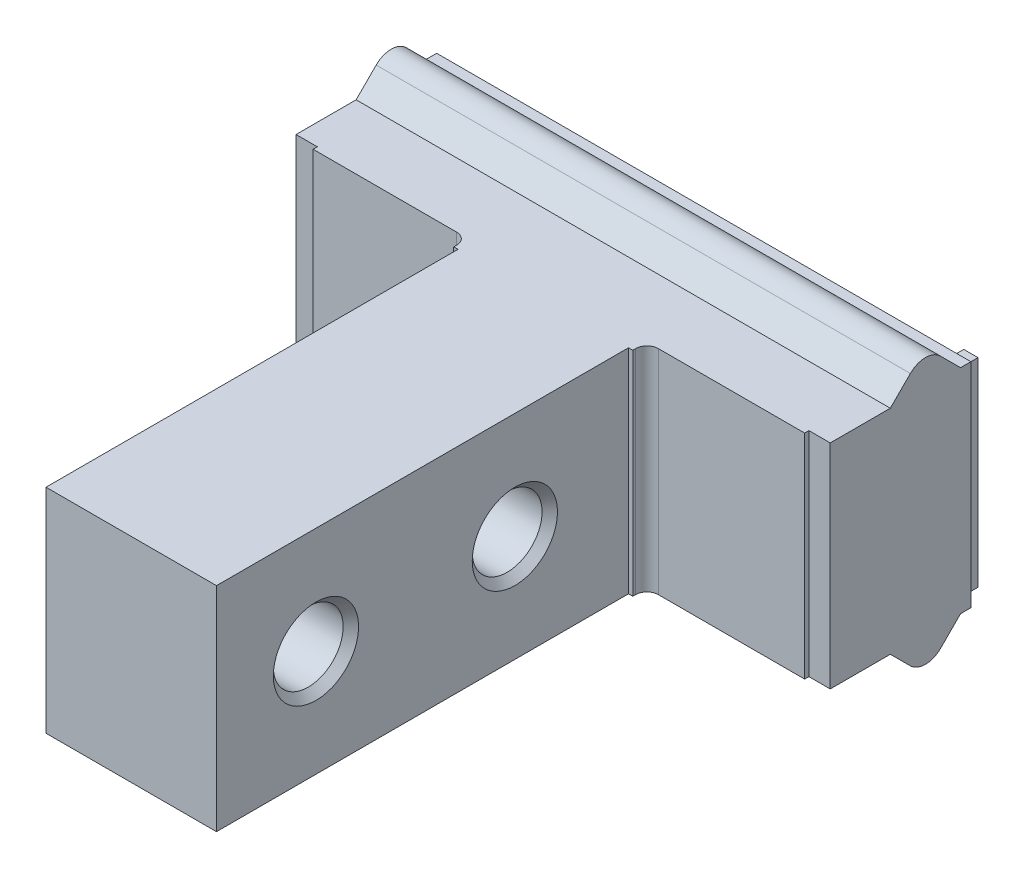
ISO-10303-21;
HEADER;
FILE_DESCRIPTION(('STEP AP214'),'2;1');
FILE_NAME('part.step','',(''),(''),'','','');
FILE_SCHEMA(('AUTOMOTIVE_DESIGN { 1 0 10303 214 1 1 1 1 }'));
ENDSEC;
DATA;
#1=APPLICATION_CONTEXT('core data for automotive mechanical design processes');
#2=APPLICATION_PROTOCOL_DEFINITION('international standard','automotive_design',2000,#1);
#3=PRODUCT_CONTEXT('',#1,'mechanical');
#4=PRODUCT('Part','Part','',(#3));
#5=PRODUCT_RELATED_PRODUCT_CATEGORY('part','',(#4));
#6=PRODUCT_DEFINITION_FORMATION('','',#4);
#7=PRODUCT_DEFINITION_CONTEXT('part definition',#1,'design');
#8=PRODUCT_DEFINITION('design','',#6,#7);
#9=PRODUCT_DEFINITION_SHAPE('','',#8);
#10=(LENGTH_UNIT() NAMED_UNIT(*) SI_UNIT(.MILLI.,.METRE.));
#11=(NAMED_UNIT(*) PLANE_ANGLE_UNIT() SI_UNIT($,.RADIAN.));
#12=(NAMED_UNIT(*) SI_UNIT($,.STERADIAN.) SOLID_ANGLE_UNIT());
#13=UNCERTAINTY_MEASURE_WITH_UNIT(LENGTH_MEASURE(1.E-05),#10,'distance_accuracy_value','');
#14=(GEOMETRIC_REPRESENTATION_CONTEXT(3) GLOBAL_UNCERTAINTY_ASSIGNED_CONTEXT((#13)) GLOBAL_UNIT_ASSIGNED_CONTEXT((#10,
#11,#12)) REPRESENTATION_CONTEXT('',''));
#15=CARTESIAN_POINT('',(0.,0.,0.));
#16=DIRECTION('',(0.,0.,1.));
#17=DIRECTION('',(1.,0.,0.));
#18=AXIS2_PLACEMENT_3D('',#15,#16,#17);
#19=CARTESIAN_POINT('',(-37.1000000000008,7.5,11.0000000000008));
#20=DIRECTION('',(0.,1.,0.));
#21=DIRECTION('',(0.,0.,1.));
#22=AXIS2_PLACEMENT_3D('',#19,#20,#21);
#23=PLANE('',#22);
#24=DIRECTION('',(-1.,0.,0.));
#25=VECTOR('',#24,1.);
#26=CARTESIAN_POINT('',(-47.2,7.5,9.9));
#27=LINE('',#26,#25);
#28=CARTESIAN_POINT('',(-47.2,7.5,9.9));
#29=VERTEX_POINT('',#28);
#30=CARTESIAN_POINT('',(-48.7,7.5,9.9));
#31=VERTEX_POINT('',#30);
#32=EDGE_CURVE('E221',#29,#31,#27,.T.);
#33=ORIENTED_EDGE('',*,*,#32,.F.);
#34=DIRECTION('',(0.,0.,1.));
#35=VECTOR('',#34,1.);
#36=CARTESIAN_POINT('',(-47.2,7.5,9.9));
#37=LINE('',#36,#35);
#38=CARTESIAN_POINT('',(-47.2,7.5,10.2));
#39=VERTEX_POINT('',#38);
#40=EDGE_CURVE('E210',#29,#39,#37,.T.);
#41=ORIENTED_EDGE('',*,*,#40,.T.);
#42=DIRECTION('',(1.,0.,0.));
#43=VECTOR('',#42,1.);
#44=CARTESIAN_POINT('',(-47.2,7.5,10.2));
#45=LINE('',#44,#43);
#46=CARTESIAN_POINT('',(-37.1,7.5,10.2));
#47=VERTEX_POINT('',#46);
#48=EDGE_CURVE('E220',#39,#47,#45,.T.);
#49=ORIENTED_EDGE('',*,*,#48,.T.);
#50=CARTESIAN_POINT('',(-37.1000000000008,7.5,11.0000000000008));
#51=DIRECTION('',(0.,1.,0.));
#52=DIRECTION('',(1.,0.,0.));
#53=AXIS2_PLACEMENT_3D('',#50,#51,#52);
#54=CIRCLE('',#53,0.800000000000812);
#55=CARTESIAN_POINT('',(-36.3,7.5,11.));
#56=VERTEX_POINT('',#55);
#57=EDGE_CURVE('E241',#56,#47,#54,.T.);
#58=ORIENTED_EDGE('',*,*,#57,.F.);
#59=DIRECTION('',(0.,0.,1.));
#60=VECTOR('',#59,1.);
#61=CARTESIAN_POINT('',(-36.3,7.5,11.));
#62=LINE('',#61,#60);
#63=CARTESIAN_POINT('',(-36.3,7.5,11.2));
#64=VERTEX_POINT('',#63);
#65=EDGE_CURVE('E245',#56,#64,#62,.T.);
#66=ORIENTED_EDGE('',*,*,#65,.T.);
#67=DIRECTION('',(1.,0.,0.));
#68=VECTOR('',#67,1.);
#69=CARTESIAN_POINT('',(-36.3,7.5,11.2));
#70=LINE('',#69,#68);
#71=CARTESIAN_POINT('',(-36.,7.5,11.2));
#72=VERTEX_POINT('',#71);
#73=EDGE_CURVE('E250',#64,#72,#70,.T.);
#74=ORIENTED_EDGE('',*,*,#73,.T.);
#75=DIRECTION('',(0.,0.,1.));
#76=VECTOR('',#75,1.);
#77=CARTESIAN_POINT('',(-36.,7.5,11.2));
#78=LINE('',#77,#76);
#79=CARTESIAN_POINT('',(-36.,7.5,40.2));
#80=VERTEX_POINT('',#79);
#81=EDGE_CURVE('E255',#72,#80,#78,.T.);
#82=ORIENTED_EDGE('',*,*,#81,.T.);
#83=DIRECTION('',(1.,0.,0.));
#84=VECTOR('',#83,1.);
#85=CARTESIAN_POINT('',(-36.,7.5,40.2));
#86=LINE('',#85,#84);
#87=CARTESIAN_POINT('',(-24.,7.5,40.2));
#88=VERTEX_POINT('',#87);
#89=EDGE_CURVE('E260',#80,#88,#86,.T.);
#90=ORIENTED_EDGE('',*,*,#89,.T.);
#91=DIRECTION('',(0.,0.,-1.));
#92=VECTOR('',#91,1.);
#93=CARTESIAN_POINT('',(-24.,7.5,40.2));
#94=LINE('',#93,#92);
#95=CARTESIAN_POINT('',(-24.,7.5,11.2));
#96=VERTEX_POINT('',#95);
#97=EDGE_CURVE('E265',#88,#96,#94,.T.);
#98=ORIENTED_EDGE('',*,*,#97,.T.);
#99=DIRECTION('',(1.,0.,0.));
#100=VECTOR('',#99,1.);
#101=CARTESIAN_POINT('',(-24.,7.5,11.2));
#102=LINE('',#101,#100);
#103=CARTESIAN_POINT('',(-23.7,7.5,11.2));
#104=VERTEX_POINT('',#103);
#105=EDGE_CURVE('E270',#96,#104,#102,.T.);
#106=ORIENTED_EDGE('',*,*,#105,.T.);
#107=DIRECTION('',(0.,0.,-1.));
#108=VECTOR('',#107,1.);
#109=CARTESIAN_POINT('',(-23.7,7.5,11.2));
#110=LINE('',#109,#108);
#111=CARTESIAN_POINT('',(-23.7,7.5,11.));
#112=VERTEX_POINT('',#111);
#113=EDGE_CURVE('E275',#104,#112,#110,.T.);
#114=ORIENTED_EDGE('',*,*,#113,.T.);
#115=CARTESIAN_POINT('',(-22.8999999999992,7.5,11.0000000000008));
#116=DIRECTION('',(0.,1.,0.));
#117=DIRECTION('',(-9.99200722161628E-13,0.,-1.));
#118=AXIS2_PLACEMENT_3D('',#115,#116,#117);
#119=CIRCLE('',#118,0.800000000000811);
#120=CARTESIAN_POINT('',(-22.9,7.5,10.2));
#121=VERTEX_POINT('',#120);
#122=EDGE_CURVE('E280',#121,#112,#119,.T.);
#123=ORIENTED_EDGE('',*,*,#122,.F.);
#124=DIRECTION('',(1.,0.,0.));
#125=VECTOR('',#124,1.);
#126=CARTESIAN_POINT('',(-22.9,7.5,10.2));
#127=LINE('',#126,#125);
#128=CARTESIAN_POINT('',(-12.6,7.5,10.2));
#129=VERTEX_POINT('',#128);
#130=EDGE_CURVE('E284',#121,#129,#127,.T.);
#131=ORIENTED_EDGE('',*,*,#130,.T.);
#132=DIRECTION('',(0.,0.,-1.));
#133=VECTOR('',#132,1.);
#134=CARTESIAN_POINT('',(-12.6,7.5,10.2));
#135=LINE('',#134,#133);
#136=CARTESIAN_POINT('',(-12.6,7.5,9.9));
#137=VERTEX_POINT('',#136);
#138=EDGE_CURVE('E289',#129,#137,#135,.T.);
#139=ORIENTED_EDGE('',*,*,#138,.T.);
#140=DIRECTION('',(-1.,0.,0.));
#141=VECTOR('',#140,1.);
#142=CARTESIAN_POINT('',(-11.1,7.5,9.9));
#143=LINE('',#142,#141);
#144=CARTESIAN_POINT('',(-11.1,7.5,9.9));
#145=VERTEX_POINT('',#144);
#146=EDGE_CURVE('E294',#145,#137,#143,.T.);
#147=ORIENTED_EDGE('',*,*,#146,.F.);
#148=DIRECTION('',(0.,0.,1.));
#149=VECTOR('',#148,1.);
#150=CARTESIAN_POINT('',(-11.1,7.5,5.6723));
#151=LINE('',#150,#149);
#152=CARTESIAN_POINT('',(-11.1,7.5,5.6723));
#153=VERTEX_POINT('',#152);
#154=EDGE_CURVE('E298',#153,#145,#151,.T.);
#155=ORIENTED_EDGE('',*,*,#154,.F.);
#156=DIRECTION('',(-1.,0.,0.));
#157=VECTOR('',#156,1.);
#158=CARTESIAN_POINT('',(-11.1,7.5,5.6723));
#159=LINE('',#158,#157);
#160=CARTESIAN_POINT('',(-48.7,7.5,5.6723));
#161=VERTEX_POINT('',#160);
#162=EDGE_CURVE('E302',#153,#161,#159,.T.);
#163=ORIENTED_EDGE('',*,*,#162,.T.);
#164=DIRECTION('',(0.,0.,1.));
#165=VECTOR('',#164,1.);
#166=CARTESIAN_POINT('',(-48.7,7.5,5.6723));
#167=LINE('',#166,#165);
#168=EDGE_CURVE('E230',#161,#31,#167,.T.);
#169=ORIENTED_EDGE('',*,*,#168,.T.);
#170=EDGE_LOOP('',(#33,#41,#49,#58,#66,#74,#82,#90,#98,#106,#114,#123,#131,#139,#147,#155,#163,#169));
#171=FACE_BOUND('',#170,.T.);
#172=ADVANCED_FACE('F16',(#171),#23,.T.);
#173=CARTESIAN_POINT('',(-11.1,7.5,9.9));
#174=DIRECTION('',(0.,0.,-1.));
#175=DIRECTION('',(-1.,0.,0.));
#176=AXIS2_PLACEMENT_3D('',#173,#174,#175);
#177=PLANE('',#176);
#178=DIRECTION('',(0.,-1.,0.));
#179=VECTOR('',#178,1.);
#180=CARTESIAN_POINT('',(-47.2,7.5,9.9));
#181=LINE('',#180,#179);
#182=CARTESIAN_POINT('',(-47.2,-7.5,9.9));
#183=VERTEX_POINT('',#182);
#184=EDGE_CURVE('E214',#29,#183,#181,.T.);
#185=ORIENTED_EDGE('',*,*,#184,.F.);
#186=ORIENTED_EDGE('',*,*,#32,.T.);
#187=DIRECTION('',(0.,-1.,0.));
#188=VECTOR('',#187,1.);
#189=CARTESIAN_POINT('',(-48.7,7.5,9.9));
#190=LINE('',#189,#188);
#191=CARTESIAN_POINT('',(-48.7,-7.5,9.9));
#192=VERTEX_POINT('',#191);
#193=EDGE_CURVE('E229',#31,#192,#190,.T.);
#194=ORIENTED_EDGE('',*,*,#193,.T.);
#195=DIRECTION('',(-1.,0.,0.));
#196=VECTOR('',#195,1.);
#197=CARTESIAN_POINT('',(-47.2,-7.5,9.9));
#198=LINE('',#197,#196);
#199=EDGE_CURVE('E228',#183,#192,#198,.T.);
#200=ORIENTED_EDGE('',*,*,#199,.F.);
#201=EDGE_LOOP('',(#185,#186,#194,#200));
#202=FACE_BOUND('',#201,.T.);
#203=ADVANCED_FACE('F226',(#202),#177,.F.);
#204=CARTESIAN_POINT('',(-47.2,50.,30.));
#205=DIRECTION('',(-1.,0.,0.));
#206=DIRECTION('',(0.,0.,1.));
#207=AXIS2_PLACEMENT_3D('',#204,#205,#206);
#208=PLANE('',#207);
#209=ORIENTED_EDGE('',*,*,#40,.F.);
#210=ORIENTED_EDGE('',*,*,#184,.T.);
#211=DIRECTION('',(0.,0.,1.));
#212=VECTOR('',#211,1.);
#213=CARTESIAN_POINT('',(-47.2,-7.5,9.9));
#214=LINE('',#213,#212);
#215=CARTESIAN_POINT('',(-47.2,-7.5,10.2));
#216=VERTEX_POINT('',#215);
#217=EDGE_CURVE('E317',#183,#216,#214,.T.);
#218=ORIENTED_EDGE('',*,*,#217,.T.);
#219=DIRECTION('',(0.,1.,0.));
#220=VECTOR('',#219,1.);
#221=CARTESIAN_POINT('',(-47.2,-7.5,10.2));
#222=LINE('',#221,#220);
#223=EDGE_CURVE('E216',#216,#39,#222,.T.);
#224=ORIENTED_EDGE('',*,*,#223,.T.);
#225=EDGE_LOOP('',(#209,#210,#218,#224));
#226=FACE_BOUND('',#225,.T.);
#227=ADVANCED_FACE('F212',(#226),#208,.T.);
#228=CARTESIAN_POINT('',(-48.7,7.5,10.2));
#229=DIRECTION('',(0.,0.,-1.));
#230=DIRECTION('',(-1.,0.,0.));
#231=AXIS2_PLACEMENT_3D('',#228,#229,#230);
#232=PLANE('',#231);
#233=ORIENTED_EDGE('',*,*,#223,.F.);
#234=DIRECTION('',(1.,0.,0.));
#235=VECTOR('',#234,1.);
#236=CARTESIAN_POINT('',(-47.2,-7.5,10.2));
#237=LINE('',#236,#235);
#238=CARTESIAN_POINT('',(-37.1,-7.5,10.2));
#239=VERTEX_POINT('',#238);
#240=EDGE_CURVE('E324',#216,#239,#237,.T.);
#241=ORIENTED_EDGE('',*,*,#240,.T.);
#242=DIRECTION('',(0.,-1.,0.));
#243=VECTOR('',#242,1.);
#244=CARTESIAN_POINT('',(-37.1,7.5,10.2));
#245=LINE('',#244,#243);
#246=EDGE_CURVE('E329',#47,#239,#245,.T.);
#247=ORIENTED_EDGE('',*,*,#246,.F.);
#248=ORIENTED_EDGE('',*,*,#48,.F.);
#249=EDGE_LOOP('',(#233,#241,#247,#248));
#250=FACE_BOUND('',#249,.T.);
#251=ADVANCED_FACE('F777',(#250),#232,.F.);
#252=CARTESIAN_POINT('',(-37.1000000000008,7.5,11.0000000000008));
#253=DIRECTION('',(0.,-1.,0.));
#254=DIRECTION('',(0.,0.,-1.));
#255=AXIS2_PLACEMENT_3D('',#252,#253,#254);
#256=CYLINDRICAL_SURFACE('',#255,0.800000000000812);
#257=CARTESIAN_POINT('',(-37.1000000000008,-7.5,11.0000000000008));
#258=DIRECTION('',(0.,1.,0.));
#259=DIRECTION('',(1.,0.,0.));
#260=AXIS2_PLACEMENT_3D('',#257,#258,#259);
#261=CIRCLE('',#260,0.800000000000812);
#262=CARTESIAN_POINT('',(-36.3,-7.5,11.));
#263=VERTEX_POINT('',#262);
#264=EDGE_CURVE('E334',#263,#239,#261,.T.);
#265=ORIENTED_EDGE('',*,*,#264,.F.);
#266=DIRECTION('',(0.,-1.,0.));
#267=VECTOR('',#266,1.);
#268=CARTESIAN_POINT('',(-36.3,7.5,11.));
#269=LINE('',#268,#267);
#270=EDGE_CURVE('E338',#56,#263,#269,.T.);
#271=ORIENTED_EDGE('',*,*,#270,.F.);
#272=ORIENTED_EDGE('',*,*,#57,.T.);
#273=ORIENTED_EDGE('',*,*,#246,.T.);
#274=EDGE_LOOP('',(#265,#271,#272,#273));
#275=FACE_BOUND('',#274,.T.);
#276=ADVANCED_FACE('F774',(#275),#256,.F.);
#277=CARTESIAN_POINT('',(-36.3,7.5,11.));
#278=DIRECTION('',(1.,0.,0.));
#279=DIRECTION('',(0.,0.,-1.));
#280=AXIS2_PLACEMENT_3D('',#277,#278,#279);
#281=PLANE('',#280);
#282=DIRECTION('',(0.,0.,1.));
#283=VECTOR('',#282,1.);
#284=CARTESIAN_POINT('',(-36.3,-7.5,11.));
#285=LINE('',#284,#283);
#286=CARTESIAN_POINT('',(-36.3,-7.5,11.2));
#287=VERTEX_POINT('',#286);
#288=EDGE_CURVE('E343',#263,#287,#285,.T.);
#289=ORIENTED_EDGE('',*,*,#288,.T.);
#290=DIRECTION('',(0.,-1.,0.));
#291=VECTOR('',#290,1.);
#292=CARTESIAN_POINT('',(-36.3,7.5,11.2));
#293=LINE('',#292,#291);
#294=EDGE_CURVE('E348',#64,#287,#293,.T.);
#295=ORIENTED_EDGE('',*,*,#294,.F.);
#296=ORIENTED_EDGE('',*,*,#65,.F.);
#297=ORIENTED_EDGE('',*,*,#270,.T.);
#298=EDGE_LOOP('',(#289,#295,#296,#297));
#299=FACE_BOUND('',#298,.T.);
#300=ADVANCED_FACE('F770',(#299),#281,.F.);
#301=CARTESIAN_POINT('',(-36.3,7.5,11.2));
#302=DIRECTION('',(0.,0.,-1.));
#303=DIRECTION('',(-1.,0.,0.));
#304=AXIS2_PLACEMENT_3D('',#301,#302,#303);
#305=PLANE('',#304);
#306=DIRECTION('',(1.,0.,0.));
#307=VECTOR('',#306,1.);
#308=CARTESIAN_POINT('',(-36.3,-7.5,11.2));
#309=LINE('',#308,#307);
#310=CARTESIAN_POINT('',(-36.,-7.5,11.2));
#311=VERTEX_POINT('',#310);
#312=EDGE_CURVE('E353',#287,#311,#309,.T.);
#313=ORIENTED_EDGE('',*,*,#312,.T.);
#314=DIRECTION('',(0.,-1.,0.));
#315=VECTOR('',#314,1.);
#316=CARTESIAN_POINT('',(-36.,7.5,11.2));
#317=LINE('',#316,#315);
#318=EDGE_CURVE('E358',#72,#311,#317,.T.);
#319=ORIENTED_EDGE('',*,*,#318,.F.);
#320=ORIENTED_EDGE('',*,*,#73,.F.);
#321=ORIENTED_EDGE('',*,*,#294,.T.);
#322=EDGE_LOOP('',(#313,#319,#320,#321));
#323=FACE_BOUND('',#322,.T.);
#324=ADVANCED_FACE('F768',(#323),#305,.F.);
#325=CARTESIAN_POINT('',(-36.,7.5,11.2));
#326=DIRECTION('',(1.,0.,0.));
#327=DIRECTION('',(0.,0.,-1.));
#328=AXIS2_PLACEMENT_3D('',#325,#326,#327);
#329=PLANE('',#328);
#330=CARTESIAN_POINT('',(-36.,0.,19.2));
#331=DIRECTION('',(-1.,0.,0.));
#332=DIRECTION('',(0.,0.,1.));
#333=AXIS2_PLACEMENT_3D('',#330,#331,#332);
#334=CIRCLE('',#333,3.00000000000001);
#335=CARTESIAN_POINT('',(-36.,0.,22.2));
#336=VERTEX_POINT('',#335);
#337=EDGE_CURVE('E363',#336,#336,#334,.T.);
#338=ORIENTED_EDGE('',*,*,#337,.F.);
#339=EDGE_LOOP('',(#338));
#340=FACE_BOUND('',#339,.T.);
#341=CARTESIAN_POINT('',(-36.,0.,33.2));
#342=DIRECTION('',(-1.,0.,0.));
#343=DIRECTION('',(0.,0.,1.));
#344=AXIS2_PLACEMENT_3D('',#341,#342,#343);
#345=CIRCLE('',#344,3.00000000000001);
#346=CARTESIAN_POINT('',(-36.,0.,36.2));
#347=VERTEX_POINT('',#346);
#348=EDGE_CURVE('E368',#347,#347,#345,.T.);
#349=ORIENTED_EDGE('',*,*,#348,.F.);
#350=EDGE_LOOP('',(#349));
#351=FACE_BOUND('',#350,.T.);
#352=DIRECTION('',(0.,0.,1.));
#353=VECTOR('',#352,1.);
#354=CARTESIAN_POINT('',(-36.,-7.5,11.2));
#355=LINE('',#354,#353);
#356=CARTESIAN_POINT('',(-36.,-7.5,40.2));
#357=VERTEX_POINT('',#356);
#358=EDGE_CURVE('E371',#311,#357,#355,.T.);
#359=ORIENTED_EDGE('',*,*,#358,.T.);
#360=DIRECTION('',(0.,-1.,0.));
#361=VECTOR('',#360,1.);
#362=CARTESIAN_POINT('',(-36.,7.5,40.2));
#363=LINE('',#362,#361);
#364=EDGE_CURVE('E374',#80,#357,#363,.T.);
#365=ORIENTED_EDGE('',*,*,#364,.F.);
#366=ORIENTED_EDGE('',*,*,#81,.F.);
#367=ORIENTED_EDGE('',*,*,#318,.T.);
#368=EDGE_LOOP('',(#359,#365,#366,#367));
#369=FACE_BOUND('',#368,.T.);
#370=ADVANCED_FACE('F763',(#340,#351,#369),#329,.F.);
#371=CARTESIAN_POINT('',(-36.,7.5,40.2));
#372=DIRECTION('',(0.,0.,-1.));
#373=DIRECTION('',(-1.,0.,0.));
#374=AXIS2_PLACEMENT_3D('',#371,#372,#373);
#375=PLANE('',#374);
#376=DIRECTION('',(1.,0.,0.));
#377=VECTOR('',#376,1.);
#378=CARTESIAN_POINT('',(-36.,-7.5,40.2));
#379=LINE('',#378,#377);
#380=CARTESIAN_POINT('',(-24.,-7.5,40.2));
#381=VERTEX_POINT('',#380);
#382=EDGE_CURVE('E379',#357,#381,#379,.T.);
#383=ORIENTED_EDGE('',*,*,#382,.T.);
#384=DIRECTION('',(0.,-1.,0.));
#385=VECTOR('',#384,1.);
#386=CARTESIAN_POINT('',(-24.,7.5,40.2));
#387=LINE('',#386,#385);
#388=EDGE_CURVE('E384',#88,#381,#387,.T.);
#389=ORIENTED_EDGE('',*,*,#388,.F.);
#390=ORIENTED_EDGE('',*,*,#89,.F.);
#391=ORIENTED_EDGE('',*,*,#364,.T.);
#392=EDGE_LOOP('',(#383,#389,#390,#391));
#393=FACE_BOUND('',#392,.T.);
#394=ADVANCED_FACE('F760',(#393),#375,.F.);
#395=CARTESIAN_POINT('',(-24.,7.5,40.2));
#396=DIRECTION('',(-1.,0.,0.));
#397=DIRECTION('',(0.,0.,1.));
#398=AXIS2_PLACEMENT_3D('',#395,#396,#397);
#399=PLANE('',#398);
#400=CARTESIAN_POINT('',(-24.,0.,19.2));
#401=DIRECTION('',(-1.,0.,0.));
#402=DIRECTION('',(0.,0.,1.));
#403=AXIS2_PLACEMENT_3D('',#400,#401,#402);
#404=CIRCLE('',#403,3.);
#405=CARTESIAN_POINT('',(-24.,0.,22.2));
#406=VERTEX_POINT('',#405);
#407=EDGE_CURVE('E389',#406,#406,#404,.T.);
#408=ORIENTED_EDGE('',*,*,#407,.T.);
#409=EDGE_LOOP('',(#408));
#410=FACE_BOUND('',#409,.T.);
#411=CARTESIAN_POINT('',(-24.,0.,33.2));
#412=DIRECTION('',(-1.,0.,0.));
#413=DIRECTION('',(0.,0.,1.));
#414=AXIS2_PLACEMENT_3D('',#411,#412,#413);
#415=CIRCLE('',#414,3.);
#416=CARTESIAN_POINT('',(-24.,0.,36.2));
#417=VERTEX_POINT('',#416);
#418=EDGE_CURVE('E394',#417,#417,#415,.T.);
#419=ORIENTED_EDGE('',*,*,#418,.T.);
#420=EDGE_LOOP('',(#419));
#421=FACE_BOUND('',#420,.T.);
#422=DIRECTION('',(0.,0.,-1.));
#423=VECTOR('',#422,1.);
#424=CARTESIAN_POINT('',(-24.,-7.5,40.2));
#425=LINE('',#424,#423);
#426=CARTESIAN_POINT('',(-24.,-7.5,11.2));
#427=VERTEX_POINT('',#426);
#428=EDGE_CURVE('E397',#381,#427,#425,.T.);
#429=ORIENTED_EDGE('',*,*,#428,.T.);
#430=DIRECTION('',(0.,-1.,0.));
#431=VECTOR('',#430,1.);
#432=CARTESIAN_POINT('',(-24.,7.5,11.2));
#433=LINE('',#432,#431);
#434=EDGE_CURVE('E400',#96,#427,#433,.T.);
#435=ORIENTED_EDGE('',*,*,#434,.F.);
#436=ORIENTED_EDGE('',*,*,#97,.F.);
#437=ORIENTED_EDGE('',*,*,#388,.T.);
#438=EDGE_LOOP('',(#429,#435,#436,#437));
#439=FACE_BOUND('',#438,.T.);
#440=ADVANCED_FACE('F757',(#410,#421,#439),#399,.F.);
#441=CARTESIAN_POINT('',(-24.,7.5,11.2));
#442=DIRECTION('',(0.,0.,-1.));
#443=DIRECTION('',(-1.,0.,0.));
#444=AXIS2_PLACEMENT_3D('',#441,#442,#443);
#445=PLANE('',#444);
#446=DIRECTION('',(1.,0.,0.));
#447=VECTOR('',#446,1.);
#448=CARTESIAN_POINT('',(-24.,-7.5,11.2));
#449=LINE('',#448,#447);
#450=CARTESIAN_POINT('',(-23.7,-7.5,11.2));
#451=VERTEX_POINT('',#450);
#452=EDGE_CURVE('E405',#427,#451,#449,.T.);
#453=ORIENTED_EDGE('',*,*,#452,.T.);
#454=DIRECTION('',(0.,-1.,0.));
#455=VECTOR('',#454,1.);
#456=CARTESIAN_POINT('',(-23.7,7.5,11.2));
#457=LINE('',#456,#455);
#458=EDGE_CURVE('E410',#104,#451,#457,.T.);
#459=ORIENTED_EDGE('',*,*,#458,.F.);
#460=ORIENTED_EDGE('',*,*,#105,.F.);
#461=ORIENTED_EDGE('',*,*,#434,.T.);
#462=EDGE_LOOP('',(#453,#459,#460,#461));
#463=FACE_BOUND('',#462,.T.);
#464=ADVANCED_FACE('F755',(#463),#445,.F.);
#465=CARTESIAN_POINT('',(-23.7,7.5,11.2));
#466=DIRECTION('',(-1.,0.,0.));
#467=DIRECTION('',(0.,0.,1.));
#468=AXIS2_PLACEMENT_3D('',#465,#466,#467);
#469=PLANE('',#468);
#470=DIRECTION('',(0.,0.,-1.));
#471=VECTOR('',#470,1.);
#472=CARTESIAN_POINT('',(-23.7,-7.5,11.2));
#473=LINE('',#472,#471);
#474=CARTESIAN_POINT('',(-23.7,-7.5,11.));
#475=VERTEX_POINT('',#474);
#476=EDGE_CURVE('E415',#451,#475,#473,.T.);
#477=ORIENTED_EDGE('',*,*,#476,.T.);
#478=DIRECTION('',(0.,-1.,0.));
#479=VECTOR('',#478,1.);
#480=CARTESIAN_POINT('',(-23.7,7.5,11.));
#481=LINE('',#480,#479);
#482=EDGE_CURVE('E420',#112,#475,#481,.T.);
#483=ORIENTED_EDGE('',*,*,#482,.F.);
#484=ORIENTED_EDGE('',*,*,#113,.F.);
#485=ORIENTED_EDGE('',*,*,#458,.T.);
#486=EDGE_LOOP('',(#477,#483,#484,#485));
#487=FACE_BOUND('',#486,.T.);
#488=ADVANCED_FACE('F751',(#487),#469,.F.);
#489=CARTESIAN_POINT('',(-22.8999999999992,7.5,11.0000000000008));
#490=DIRECTION('',(0.,-1.,0.));
#491=DIRECTION('',(0.,0.,-1.));
#492=AXIS2_PLACEMENT_3D('',#489,#490,#491);
#493=CYLINDRICAL_SURFACE('',#492,0.800000000000811);
#494=CARTESIAN_POINT('',(-22.8999999999992,-7.5,11.0000000000008));
#495=DIRECTION('',(0.,1.,0.));
#496=DIRECTION('',(-9.99200722161628E-13,0.,-1.));
#497=AXIS2_PLACEMENT_3D('',#494,#495,#496);
#498=CIRCLE('',#497,0.800000000000811);
#499=CARTESIAN_POINT('',(-22.9,-7.5,10.2));
#500=VERTEX_POINT('',#499);
#501=EDGE_CURVE('E425',#500,#475,#498,.T.);
#502=ORIENTED_EDGE('',*,*,#501,.F.);
#503=DIRECTION('',(0.,-1.,0.));
#504=VECTOR('',#503,1.);
#505=CARTESIAN_POINT('',(-22.9,7.5,10.2));
#506=LINE('',#505,#504);
#507=EDGE_CURVE('E429',#121,#500,#506,.T.);
#508=ORIENTED_EDGE('',*,*,#507,.F.);
#509=ORIENTED_EDGE('',*,*,#122,.T.);
#510=ORIENTED_EDGE('',*,*,#482,.T.);
#511=EDGE_LOOP('',(#502,#508,#509,#510));
#512=FACE_BOUND('',#511,.T.);
#513=ADVANCED_FACE('F748',(#512),#493,.F.);
#514=CARTESIAN_POINT('',(-22.9,7.5,10.2));
#515=DIRECTION('',(0.,0.,-1.));
#516=DIRECTION('',(-1.,0.,0.));
#517=AXIS2_PLACEMENT_3D('',#514,#515,#516);
#518=PLANE('',#517);
#519=DIRECTION('',(0.,-1.,0.));
#520=VECTOR('',#519,1.);
#521=CARTESIAN_POINT('',(-12.6,7.5,10.2));
#522=LINE('',#521,#520);
#523=CARTESIAN_POINT('',(-12.6,-7.5,10.2));
#524=VERTEX_POINT('',#523);
#525=EDGE_CURVE('E434',#129,#524,#522,.T.);
#526=ORIENTED_EDGE('',*,*,#525,.F.);
#527=ORIENTED_EDGE('',*,*,#130,.F.);
#528=ORIENTED_EDGE('',*,*,#507,.T.);
#529=DIRECTION('',(1.,0.,0.));
#530=VECTOR('',#529,1.);
#531=CARTESIAN_POINT('',(-22.9,-7.5,10.2));
#532=LINE('',#531,#530);
#533=EDGE_CURVE('E439',#500,#524,#532,.T.);
#534=ORIENTED_EDGE('',*,*,#533,.T.);
#535=EDGE_LOOP('',(#526,#527,#528,#534));
#536=FACE_BOUND('',#535,.T.);
#537=ADVANCED_FACE('F744',(#536),#518,.F.);
#538=CARTESIAN_POINT('',(-12.6,50.,0.));
#539=DIRECTION('',(1.,0.,0.));
#540=DIRECTION('',(0.,0.,-1.));
#541=AXIS2_PLACEMENT_3D('',#538,#539,#540);
#542=PLANE('',#541);
#543=DIRECTION('',(0.,0.,-1.));
#544=VECTOR('',#543,1.);
#545=CARTESIAN_POINT('',(-12.6,-7.5,10.2));
#546=LINE('',#545,#544);
#547=CARTESIAN_POINT('',(-12.6,-7.5,9.9));
#548=VERTEX_POINT('',#547);
#549=EDGE_CURVE('E444',#524,#548,#546,.T.);
#550=ORIENTED_EDGE('',*,*,#549,.T.);
#551=DIRECTION('',(0.,1.,0.));
#552=VECTOR('',#551,1.);
#553=CARTESIAN_POINT('',(-12.6,-7.5,9.9));
#554=LINE('',#553,#552);
#555=EDGE_CURVE('E449',#548,#137,#554,.T.);
#556=ORIENTED_EDGE('',*,*,#555,.T.);
#557=ORIENTED_EDGE('',*,*,#138,.F.);
#558=ORIENTED_EDGE('',*,*,#525,.T.);
#559=EDGE_LOOP('',(#550,#556,#557,#558));
#560=FACE_BOUND('',#559,.T.);
#561=ADVANCED_FACE('F742',(#560),#542,.T.);
#562=ORIENTED_EDGE('',*,*,#555,.F.);
#563=DIRECTION('',(-1.,0.,0.));
#564=VECTOR('',#563,1.);
#565=CARTESIAN_POINT('',(-11.1,-7.5,9.9));
#566=LINE('',#565,#564);
#567=CARTESIAN_POINT('',(-11.1,-7.5,9.9));
#568=VERTEX_POINT('',#567);
#569=EDGE_CURVE('E454',#568,#548,#566,.T.);
#570=ORIENTED_EDGE('',*,*,#569,.F.);
#571=DIRECTION('',(0.,-1.,0.));
#572=VECTOR('',#571,1.);
#573=CARTESIAN_POINT('',(-11.1,7.5,9.9));
#574=LINE('',#573,#572);
#575=EDGE_CURVE('E458',#145,#568,#574,.T.);
#576=ORIENTED_EDGE('',*,*,#575,.F.);
#577=ORIENTED_EDGE('',*,*,#146,.T.);
#578=EDGE_LOOP('',(#562,#570,#576,#577));
#579=FACE_BOUND('',#578,.T.);
#580=ADVANCED_FACE('F691',(#579),#177,.F.);
#581=CARTESIAN_POINT('',(-11.1,-7.85,3.1995));
#582=DIRECTION('',(1.,0.,0.));
#583=DIRECTION('',(0.,0.,-1.));
#584=AXIS2_PLACEMENT_3D('',#581,#582,#583);
#585=PLANE('',#584);
#586=ORIENTED_EDGE('',*,*,#154,.T.);
#587=ORIENTED_EDGE('',*,*,#575,.T.);
#588=DIRECTION('',(0.,0.,-1.));
#589=VECTOR('',#588,1.);
#590=CARTESIAN_POINT('',(-11.1,-7.5,9.9));
#591=LINE('',#590,#589);
#592=CARTESIAN_POINT('',(-11.1,-7.5,5.6723));
#593=VERTEX_POINT('',#592);
#594=EDGE_CURVE('E463',#568,#593,#591,.T.);
#595=ORIENTED_EDGE('',*,*,#594,.T.);
#596=DIRECTION('',(0.,-0.706736105588934,-0.707477262572436));
#597=VECTOR('',#596,1.);
#598=CARTESIAN_POINT('',(-11.1,-7.5,5.6723));
#599=LINE('',#598,#597);
#600=CARTESIAN_POINT('',(-11.1,-8.9112158938586,4.2596041583834));
#601=VERTEX_POINT('',#600);
#602=EDGE_CURVE('E468',#593,#601,#599,.T.);
#603=ORIENTED_EDGE('',*,*,#602,.T.);
#604=CARTESIAN_POINT('',(-11.1,-7.85,3.1995));
#605=DIRECTION('',(1.,0.,0.));
#606=DIRECTION('',(0.,-0.707477262572418,0.706736105588952));
#607=AXIS2_PLACEMENT_3D('',#604,#605,#606);
#608=CIRCLE('',#607,1.49999999999997);
#609=CARTESIAN_POINT('',(-11.1,-8.9106901166031,2.1388697738889));
#610=VERTEX_POINT('',#609);
#611=EDGE_CURVE('E473',#601,#610,#608,.T.);
#612=ORIENTED_EDGE('',*,*,#611,.T.);
#613=DIRECTION('',(0.,0.707086817407423,-0.70712674440205));
#614=VECTOR('',#613,1.);
#615=CARTESIAN_POINT('',(-11.1,-8.9106901166031,2.1388697738889));
#616=LINE('',#615,#614);
#617=CARTESIAN_POINT('',(-11.1,-7.5,0.72809999999999));
#618=VERTEX_POINT('',#617);
#619=EDGE_CURVE('E478',#610,#618,#616,.T.);
#620=ORIENTED_EDGE('',*,*,#619,.T.);
#621=DIRECTION('',(0.,0.,-1.));
#622=VECTOR('',#621,1.);
#623=CARTESIAN_POINT('',(-11.1,-7.5,0.72809999999999));
#624=LINE('',#623,#622);
#625=CARTESIAN_POINT('',(-11.1,-7.5,0.));
#626=VERTEX_POINT('',#625);
#627=EDGE_CURVE('E483',#618,#626,#624,.T.);
#628=ORIENTED_EDGE('',*,*,#627,.T.);
#629=DIRECTION('',(0.,1.,0.));
#630=VECTOR('',#629,1.);
#631=CARTESIAN_POINT('',(-11.1,-7.5,0.));
#632=LINE('',#631,#630);
#633=CARTESIAN_POINT('',(-11.1,7.5,0.));
#634=VERTEX_POINT('',#633);
#635=EDGE_CURVE('E488',#626,#634,#632,.T.);
#636=ORIENTED_EDGE('',*,*,#635,.T.);
#637=DIRECTION('',(0.,0.,1.));
#638=VECTOR('',#637,1.);
#639=CARTESIAN_POINT('',(-11.1,7.5,0.));
#640=LINE('',#639,#638);
#641=CARTESIAN_POINT('',(-11.1,7.5,0.7281));
#642=VERTEX_POINT('',#641);
#643=EDGE_CURVE('E493',#634,#642,#640,.T.);
#644=ORIENTED_EDGE('',*,*,#643,.T.);
#645=DIRECTION('',(0.,0.707086817407425,0.707126744402048));
#646=VECTOR('',#645,1.);
#647=CARTESIAN_POINT('',(-11.1,7.5,0.7281));
#648=LINE('',#647,#646);
#649=CARTESIAN_POINT('',(-11.1,8.9106901166031,2.1388697738889));
#650=VERTEX_POINT('',#649);
#651=EDGE_CURVE('E498',#642,#650,#648,.T.);
#652=ORIENTED_EDGE('',*,*,#651,.T.);
#653=CARTESIAN_POINT('',(-11.1,7.85,3.1995));
#654=DIRECTION('',(1.,0.,0.));
#655=DIRECTION('',(0.,0.707126744402069,-0.707086817407403));
#656=AXIS2_PLACEMENT_3D('',#653,#654,#655);
#657=CIRCLE('',#656,1.49999999999996);
#658=CARTESIAN_POINT('',(-11.1,8.9112158938586,4.2596041583834));
#659=VERTEX_POINT('',#658);
#660=EDGE_CURVE('E503',#650,#659,#657,.T.);
#661=ORIENTED_EDGE('',*,*,#660,.T.);
#662=DIRECTION('',(0.,-0.706736105588934,0.707477262572436));
#663=VECTOR('',#662,1.);
#664=CARTESIAN_POINT('',(-11.1,8.9112158938586,4.2596041583834));
#665=LINE('',#664,#663);
#666=EDGE_CURVE('E508',#659,#153,#665,.T.);
#667=ORIENTED_EDGE('',*,*,#666,.T.);
#668=EDGE_LOOP('',(#586,#587,#595,#603,#612,#620,#628,#636,#644,#652,#661,#667));
#669=FACE_BOUND('',#668,.T.);
#670=ADVANCED_FACE('F717',(#669),#585,.T.);
#671=CARTESIAN_POINT('',(-11.1,8.9112158938586,4.2596041583834));
#672=DIRECTION('',(0.,-0.707477262572436,-0.706736105588934));
#673=DIRECTION('',(0.,0.706736105588934,-0.707477262572436));
#674=AXIS2_PLACEMENT_3D('',#671,#672,#673);
#675=PLANE('',#674);
#676=DIRECTION('',(0.,-0.706736105588934,0.707477262572436));
#677=VECTOR('',#676,1.);
#678=CARTESIAN_POINT('',(-48.7,8.9112158938586,4.2596041583834));
#679=LINE('',#678,#677);
#680=CARTESIAN_POINT('',(-48.7,8.9112158938586,4.2596041583834));
#681=VERTEX_POINT('',#680);
#682=EDGE_CURVE('E513',#681,#161,#679,.T.);
#683=ORIENTED_EDGE('',*,*,#682,.T.);
#684=ORIENTED_EDGE('',*,*,#162,.F.);
#685=ORIENTED_EDGE('',*,*,#666,.F.);
#686=DIRECTION('',(-1.,0.,0.));
#687=VECTOR('',#686,1.);
#688=CARTESIAN_POINT('',(-11.1,8.9112158938586,4.2596041583834));
#689=LINE('',#688,#687);
#690=EDGE_CURVE('E518',#659,#681,#689,.T.);
#691=ORIENTED_EDGE('',*,*,#690,.T.);
#692=EDGE_LOOP('',(#683,#684,#685,#691));
#693=FACE_BOUND('',#692,.T.);
#694=ADVANCED_FACE('F780',(#693),#675,.F.);
#695=CARTESIAN_POINT('',(-48.7,-7.85,3.1995));
#696=DIRECTION('',(1.,0.,0.));
#697=DIRECTION('',(0.,0.,-1.));
#698=AXIS2_PLACEMENT_3D('',#695,#696,#697);
#699=PLANE('',#698);
#700=ORIENTED_EDGE('',*,*,#168,.F.);
#701=ORIENTED_EDGE('',*,*,#682,.F.);
#702=CARTESIAN_POINT('',(-48.7,7.85,3.1995));
#703=DIRECTION('',(1.,0.,0.));
#704=DIRECTION('',(0.,0.707126744402069,-0.707086817407403));
#705=AXIS2_PLACEMENT_3D('',#702,#703,#704);
#706=CIRCLE('',#705,1.49999999999996);
#707=CARTESIAN_POINT('',(-48.7,8.9106901166031,2.1388697738889));
#708=VERTEX_POINT('',#707);
#709=EDGE_CURVE('E523',#708,#681,#706,.T.);
#710=ORIENTED_EDGE('',*,*,#709,.F.);
#711=DIRECTION('',(0.,0.707086817407425,0.707126744402048));
#712=VECTOR('',#711,1.);
#713=CARTESIAN_POINT('',(-48.7,7.5,0.7281));
#714=LINE('',#713,#712);
#715=CARTESIAN_POINT('',(-48.7,7.5,0.7281));
#716=VERTEX_POINT('',#715);
#717=EDGE_CURVE('E527',#716,#708,#714,.T.);
#718=ORIENTED_EDGE('',*,*,#717,.F.);
#719=DIRECTION('',(0.,0.,1.));
#720=VECTOR('',#719,1.);
#721=CARTESIAN_POINT('',(-48.7,7.5,0.));
#722=LINE('',#721,#720);
#723=CARTESIAN_POINT('',(-48.7,7.5,0.));
#724=VERTEX_POINT('',#723);
#725=EDGE_CURVE('E532',#724,#716,#722,.T.);
#726=ORIENTED_EDGE('',*,*,#725,.F.);
#727=DIRECTION('',(0.,1.,0.));
#728=VECTOR('',#727,1.);
#729=CARTESIAN_POINT('',(-48.7,-7.5,0.));
#730=LINE('',#729,#728);
#731=CARTESIAN_POINT('',(-48.7,-7.5,0.));
#732=VERTEX_POINT('',#731);
#733=EDGE_CURVE('E537',#732,#724,#730,.T.);
#734=ORIENTED_EDGE('',*,*,#733,.F.);
#735=DIRECTION('',(0.,0.,-1.));
#736=VECTOR('',#735,1.);
#737=CARTESIAN_POINT('',(-48.7,-7.5,0.72809999999999));
#738=LINE('',#737,#736);
#739=CARTESIAN_POINT('',(-48.7,-7.5,0.72809999999999));
#740=VERTEX_POINT('',#739);
#741=EDGE_CURVE('E542',#740,#732,#738,.T.);
#742=ORIENTED_EDGE('',*,*,#741,.F.);
#743=DIRECTION('',(0.,0.707086817407423,-0.70712674440205));
#744=VECTOR('',#743,1.);
#745=CARTESIAN_POINT('',(-48.7,-8.9106901166031,2.1388697738889));
#746=LINE('',#745,#744);
#747=CARTESIAN_POINT('',(-48.7,-8.9106901166031,2.1388697738889));
#748=VERTEX_POINT('',#747);
#749=EDGE_CURVE('E547',#748,#740,#746,.T.);
#750=ORIENTED_EDGE('',*,*,#749,.F.);
#751=CARTESIAN_POINT('',(-48.7,-7.85,3.1995));
#752=DIRECTION('',(1.,0.,0.));
#753=DIRECTION('',(0.,-0.707477262572418,0.706736105588952));
#754=AXIS2_PLACEMENT_3D('',#751,#752,#753);
#755=CIRCLE('',#754,1.49999999999997);
#756=CARTESIAN_POINT('',(-48.7,-8.9112158938586,4.2596041583834));
#757=VERTEX_POINT('',#756);
#758=EDGE_CURVE('E552',#757,#748,#755,.T.);
#759=ORIENTED_EDGE('',*,*,#758,.F.);
#760=DIRECTION('',(0.,-0.706736105588934,-0.707477262572436));
#761=VECTOR('',#760,1.);
#762=CARTESIAN_POINT('',(-48.7,-7.5,5.6723));
#763=LINE('',#762,#761);
#764=CARTESIAN_POINT('',(-48.7,-7.5,5.6723));
#765=VERTEX_POINT('',#764);
#766=EDGE_CURVE('E557',#765,#757,#763,.T.);
#767=ORIENTED_EDGE('',*,*,#766,.F.);
#768=DIRECTION('',(0.,0.,-1.));
#769=VECTOR('',#768,1.);
#770=CARTESIAN_POINT('',(-48.7,-7.5,9.9));
#771=LINE('',#770,#769);
#772=EDGE_CURVE('E562',#192,#765,#771,.T.);
#773=ORIENTED_EDGE('',*,*,#772,.F.);
#774=ORIENTED_EDGE('',*,*,#193,.F.);
#775=EDGE_LOOP('',(#700,#701,#710,#718,#726,#734,#742,#750,#759,#767,#773,#774));
#776=FACE_BOUND('',#775,.T.);
#777=ADVANCED_FACE('F710',(#776),#699,.F.);
#778=CARTESIAN_POINT('',(-37.1000000000008,-7.5,11.0000000000008));
#779=DIRECTION('',(0.,1.,0.));
#780=DIRECTION('',(0.,0.,1.));
#781=AXIS2_PLACEMENT_3D('',#778,#779,#780);
#782=PLANE('',#781);
#783=ORIENTED_EDGE('',*,*,#772,.T.);
#784=DIRECTION('',(-1.,0.,0.));
#785=VECTOR('',#784,1.);
#786=CARTESIAN_POINT('',(-11.1,-7.5,5.6723));
#787=LINE('',#786,#785);
#788=EDGE_CURVE('E567',#593,#765,#787,.T.);
#789=ORIENTED_EDGE('',*,*,#788,.F.);
#790=ORIENTED_EDGE('',*,*,#594,.F.);
#791=ORIENTED_EDGE('',*,*,#569,.T.);
#792=ORIENTED_EDGE('',*,*,#549,.F.);
#793=ORIENTED_EDGE('',*,*,#533,.F.);
#794=ORIENTED_EDGE('',*,*,#501,.T.);
#795=ORIENTED_EDGE('',*,*,#476,.F.);
#796=ORIENTED_EDGE('',*,*,#452,.F.);
#797=ORIENTED_EDGE('',*,*,#428,.F.);
#798=ORIENTED_EDGE('',*,*,#382,.F.);
#799=ORIENTED_EDGE('',*,*,#358,.F.);
#800=ORIENTED_EDGE('',*,*,#312,.F.);
#801=ORIENTED_EDGE('',*,*,#288,.F.);
#802=ORIENTED_EDGE('',*,*,#264,.T.);
#803=ORIENTED_EDGE('',*,*,#240,.F.);
#804=ORIENTED_EDGE('',*,*,#217,.F.);
#805=ORIENTED_EDGE('',*,*,#199,.T.);
#806=EDGE_LOOP('',(#783,#789,#790,#791,#792,#793,#794,#795,#796,#797,#798,#799,#800,#801,#802,
#803,#804,#805));
#807=FACE_BOUND('',#806,.T.);
#808=ADVANCED_FACE('F732',(#807),#782,.F.);
#809=CARTESIAN_POINT('',(-35.4585,0.,19.2));
#810=DIRECTION('',(-1.,0.,0.));
#811=DIRECTION('',(0.,0.,1.));
#812=AXIS2_PLACEMENT_3D('',#809,#810,#811);
#813=CONICAL_SURFACE('',#812,2.4585,0.785398163397455);
#814=ORIENTED_EDGE('',*,*,#337,.T.);
#815=EDGE_LOOP('',(#814));
#816=FACE_BOUND('',#815,.T.);
#817=CARTESIAN_POINT('',(-35.4585,0.,19.2));
#818=DIRECTION('',(-1.,0.,0.));
#819=DIRECTION('',(0.,0.,1.));
#820=AXIS2_PLACEMENT_3D('',#817,#818,#819);
#821=CIRCLE('',#820,2.4585);
#822=CARTESIAN_POINT('',(-35.4585,0.,21.6585));
#823=VERTEX_POINT('',#822);
#824=EDGE_CURVE('E571',#823,#823,#821,.T.);
#825=ORIENTED_EDGE('',*,*,#824,.F.);
#826=EDGE_LOOP('',(#825));
#827=FACE_BOUND('',#826,.T.);
#828=ADVANCED_FACE('F970',(#816,#827),#813,.F.);
#829=CARTESIAN_POINT('',(-35.4585,0.,33.2));
#830=DIRECTION('',(-1.,0.,0.));
#831=DIRECTION('',(0.,0.,1.));
#832=AXIS2_PLACEMENT_3D('',#829,#830,#831);
#833=CONICAL_SURFACE('',#832,2.4585,0.785398163397455);
#834=ORIENTED_EDGE('',*,*,#348,.T.);
#835=EDGE_LOOP('',(#834));
#836=FACE_BOUND('',#835,.T.);
#837=CARTESIAN_POINT('',(-35.4585,0.,33.2));
#838=DIRECTION('',(-1.,0.,0.));
#839=DIRECTION('',(0.,0.,1.));
#840=AXIS2_PLACEMENT_3D('',#837,#838,#839);
#841=CIRCLE('',#840,2.4585);
#842=CARTESIAN_POINT('',(-35.4585,0.,35.6585));
#843=VERTEX_POINT('',#842);
#844=EDGE_CURVE('E576',#843,#843,#841,.T.);
#845=ORIENTED_EDGE('',*,*,#844,.F.);
#846=EDGE_LOOP('',(#845));
#847=FACE_BOUND('',#846,.T.);
#848=ADVANCED_FACE('F960',(#836,#847),#833,.F.);
#849=CARTESIAN_POINT('',(-24.,0.,19.2));
#850=DIRECTION('',(1.,0.,0.));
#851=DIRECTION('',(0.,0.,-1.));
#852=AXIS2_PLACEMENT_3D('',#849,#850,#851);
#853=CONICAL_SURFACE('',#852,3.,0.785398163397455);
#854=CARTESIAN_POINT('',(-24.5415,0.,19.2));
#855=DIRECTION('',(-1.,0.,0.));
#856=DIRECTION('',(0.,0.,1.));
#857=AXIS2_PLACEMENT_3D('',#854,#855,#856);
#858=CIRCLE('',#857,2.4585);
#859=CARTESIAN_POINT('',(-24.5415,0.,21.6585));
#860=VERTEX_POINT('',#859);
#861=EDGE_CURVE('E579',#860,#860,#858,.T.);
#862=ORIENTED_EDGE('',*,*,#861,.T.);
#863=EDGE_LOOP('',(#862));
#864=FACE_BOUND('',#863,.T.);
#865=ORIENTED_EDGE('',*,*,#407,.F.);
#866=EDGE_LOOP('',(#865));
#867=FACE_BOUND('',#866,.T.);
#868=ADVANCED_FACE('F950',(#864,#867),#853,.F.);
#869=CARTESIAN_POINT('',(-24.,0.,33.2));
#870=DIRECTION('',(1.,0.,0.));
#871=DIRECTION('',(0.,0.,-1.));
#872=AXIS2_PLACEMENT_3D('',#869,#870,#871);
#873=CONICAL_SURFACE('',#872,3.,0.785398163397455);
#874=CARTESIAN_POINT('',(-24.5415,0.,33.2));
#875=DIRECTION('',(-1.,0.,0.));
#876=DIRECTION('',(0.,0.,1.));
#877=AXIS2_PLACEMENT_3D('',#874,#875,#876);
#878=CIRCLE('',#877,2.4585);
#879=CARTESIAN_POINT('',(-24.5415,0.,35.6585));
#880=VERTEX_POINT('',#879);
#881=EDGE_CURVE('E582',#880,#880,#878,.T.);
#882=ORIENTED_EDGE('',*,*,#881,.T.);
#883=EDGE_LOOP('',(#882));
#884=FACE_BOUND('',#883,.T.);
#885=ORIENTED_EDGE('',*,*,#418,.F.);
#886=EDGE_LOOP('',(#885));
#887=FACE_BOUND('',#886,.T.);
#888=ADVANCED_FACE('F941',(#884,#887),#873,.F.);
#889=CARTESIAN_POINT('',(-11.1,-7.5,5.6723));
#890=DIRECTION('',(0.,0.707477262572436,-0.706736105588934));
#891=DIRECTION('',(0.,0.706736105588934,0.707477262572436));
#892=AXIS2_PLACEMENT_3D('',#889,#890,#891);
#893=PLANE('',#892);
#894=ORIENTED_EDGE('',*,*,#766,.T.);
#895=DIRECTION('',(-1.,0.,0.));
#896=VECTOR('',#895,1.);
#897=CARTESIAN_POINT('',(-11.1,-8.9112158938586,4.2596041583834));
#898=LINE('',#897,#896);
#899=EDGE_CURVE('E585',#601,#757,#898,.T.);
#900=ORIENTED_EDGE('',*,*,#899,.F.);
#901=ORIENTED_EDGE('',*,*,#602,.F.);
#902=ORIENTED_EDGE('',*,*,#788,.T.);
#903=EDGE_LOOP('',(#894,#900,#901,#902));
#904=FACE_BOUND('',#903,.T.);
#905=ADVANCED_FACE('F729',(#904),#893,.F.);
#906=CARTESIAN_POINT('',(-11.1,-7.85,3.1995));
#907=DIRECTION('',(-1.,0.,0.));
#908=DIRECTION('',(0.,0.,1.));
#909=AXIS2_PLACEMENT_3D('',#906,#907,#908);
#910=CYLINDRICAL_SURFACE('',#909,1.49999999999997);
#911=ORIENTED_EDGE('',*,*,#758,.T.);
#912=DIRECTION('',(-1.,0.,0.));
#913=VECTOR('',#912,1.);
#914=CARTESIAN_POINT('',(-11.1,-8.9106901166031,2.1388697738889));
#915=LINE('',#914,#913);
#916=EDGE_CURVE('E587',#610,#748,#915,.T.);
#917=ORIENTED_EDGE('',*,*,#916,.F.);
#918=ORIENTED_EDGE('',*,*,#611,.F.);
#919=ORIENTED_EDGE('',*,*,#899,.T.);
#920=EDGE_LOOP('',(#911,#917,#918,#919));
#921=FACE_BOUND('',#920,.T.);
#922=ADVANCED_FACE('F723',(#921),#910,.T.);
#923=CARTESIAN_POINT('',(-11.1,-8.9106901166031,2.1388697738889));
#924=DIRECTION('',(0.,0.70712674440205,0.707086817407422));
#925=DIRECTION('',(0.,-0.707086817407422,0.70712674440205));
#926=AXIS2_PLACEMENT_3D('',#923,#924,#925);
#927=PLANE('',#926);
#928=ORIENTED_EDGE('',*,*,#749,.T.);
#929=DIRECTION('',(-1.,0.,0.));
#930=VECTOR('',#929,1.);
#931=CARTESIAN_POINT('',(-11.1,-7.5,0.72809999999999));
#932=LINE('',#931,#930);
#933=EDGE_CURVE('E591',#618,#740,#932,.T.);
#934=ORIENTED_EDGE('',*,*,#933,.F.);
#935=ORIENTED_EDGE('',*,*,#619,.F.);
#936=ORIENTED_EDGE('',*,*,#916,.T.);
#937=EDGE_LOOP('',(#928,#934,#935,#936));
#938=FACE_BOUND('',#937,.T.);
#939=ADVANCED_FACE('F720',(#938),#927,.F.);
#940=ORIENTED_EDGE('',*,*,#933,.T.);
#941=ORIENTED_EDGE('',*,*,#741,.T.);
#942=DIRECTION('',(-1.,0.,0.));
#943=VECTOR('',#942,1.);
#944=CARTESIAN_POINT('',(-11.1,-7.5,0.));
#945=LINE('',#944,#943);
#946=EDGE_CURVE('E595',#626,#732,#945,.T.);
#947=ORIENTED_EDGE('',*,*,#946,.F.);
#948=ORIENTED_EDGE('',*,*,#627,.F.);
#949=EDGE_LOOP('',(#940,#941,#947,#948));
#950=FACE_BOUND('',#949,.T.);
#951=ADVANCED_FACE('F702',(#950),#782,.F.);
#952=CARTESIAN_POINT('',(-11.1,7.5,0.));
#953=DIRECTION('',(0.,0.,1.));
#954=DIRECTION('',(1.,0.,0.));
#955=AXIS2_PLACEMENT_3D('',#952,#953,#954);
#956=PLANE('',#955);
#957=DIRECTION('',(1.,0.,0.));
#958=VECTOR('',#957,1.);
#959=CARTESIAN_POINT('',(-12.6,7.,0.));
#960=LINE('',#959,#958);
#961=CARTESIAN_POINT('',(-12.6,7.,0.));
#962=VERTEX_POINT('',#961);
#963=CARTESIAN_POINT('',(-11.6,7.,0.));
#964=VERTEX_POINT('',#963);
#965=EDGE_CURVE('E599',#962,#964,#960,.T.);
#966=ORIENTED_EDGE('',*,*,#965,.F.);
#967=DIRECTION('',(0.,-1.,0.));
#968=VECTOR('',#967,1.);
#969=CARTESIAN_POINT('',(-12.6,7.,0.));
#970=LINE('',#969,#968);
#971=CARTESIAN_POINT('',(-12.6,-7.,0.));
#972=VERTEX_POINT('',#971);
#973=EDGE_CURVE('E604',#962,#972,#970,.T.);
#974=ORIENTED_EDGE('',*,*,#973,.T.);
#975=DIRECTION('',(-1.,0.,0.));
#976=VECTOR('',#975,1.);
#977=CARTESIAN_POINT('',(-11.6,-7.,0.));
#978=LINE('',#977,#976);
#979=CARTESIAN_POINT('',(-11.6,-7.,0.));
#980=VERTEX_POINT('',#979);
#981=EDGE_CURVE('E609',#980,#972,#978,.T.);
#982=ORIENTED_EDGE('',*,*,#981,.F.);
#983=DIRECTION('',(0.,-1.,0.));
#984=VECTOR('',#983,1.);
#985=CARTESIAN_POINT('',(-11.6,7.,0.));
#986=LINE('',#985,#984);
#987=EDGE_CURVE('E613',#964,#980,#986,.T.);
#988=ORIENTED_EDGE('',*,*,#987,.F.);
#989=EDGE_LOOP('',(#966,#974,#982,#988));
#990=FACE_BOUND('',#989,.T.);
#991=ORIENTED_EDGE('',*,*,#946,.T.);
#992=ORIENTED_EDGE('',*,*,#733,.T.);
#993=DIRECTION('',(-1.,0.,0.));
#994=VECTOR('',#993,1.);
#995=CARTESIAN_POINT('',(-11.1,7.5,0.));
#996=LINE('',#995,#994);
#997=EDGE_CURVE('E617',#634,#724,#996,.T.);
#998=ORIENTED_EDGE('',*,*,#997,.F.);
#999=ORIENTED_EDGE('',*,*,#635,.F.);
#1000=EDGE_LOOP('',(#991,#992,#998,#999));
#1001=FACE_BOUND('',#1000,.T.);
#1002=ADVANCED_FACE('F671',(#990,#1001),#956,.F.);
#1003=ORIENTED_EDGE('',*,*,#997,.T.);
#1004=ORIENTED_EDGE('',*,*,#725,.T.);
#1005=DIRECTION('',(-1.,0.,0.));
#1006=VECTOR('',#1005,1.);
#1007=CARTESIAN_POINT('',(-11.1,7.5,0.7281));
#1008=LINE('',#1007,#1006);
#1009=EDGE_CURVE('E621',#642,#716,#1008,.T.);
#1010=ORIENTED_EDGE('',*,*,#1009,.F.);
#1011=ORIENTED_EDGE('',*,*,#643,.F.);
#1012=EDGE_LOOP('',(#1003,#1004,#1010,#1011));
#1013=FACE_BOUND('',#1012,.T.);
#1014=ADVANCED_FACE('F686',(#1013),#23,.T.);
#1015=CARTESIAN_POINT('',(-11.1,7.5,0.7281));
#1016=DIRECTION('',(0.,-0.707126744402048,0.707086817407425));
#1017=DIRECTION('',(0.,-0.707086817407425,-0.707126744402048));
#1018=AXIS2_PLACEMENT_3D('',#1015,#1016,#1017);
#1019=PLANE('',#1018);
#1020=ORIENTED_EDGE('',*,*,#717,.T.);
#1021=DIRECTION('',(-1.,0.,0.));
#1022=VECTOR('',#1021,1.);
#1023=CARTESIAN_POINT('',(-11.1,8.9106901166031,2.1388697738889));
#1024=LINE('',#1023,#1022);
#1025=EDGE_CURVE('E625',#650,#708,#1024,.T.);
#1026=ORIENTED_EDGE('',*,*,#1025,.F.);
#1027=ORIENTED_EDGE('',*,*,#651,.F.);
#1028=ORIENTED_EDGE('',*,*,#1009,.T.);
#1029=EDGE_LOOP('',(#1020,#1026,#1027,#1028));
#1030=FACE_BOUND('',#1029,.T.);
#1031=ADVANCED_FACE('F693',(#1030),#1019,.F.);
#1032=CARTESIAN_POINT('',(-11.1,7.85,3.1995));
#1033=DIRECTION('',(-1.,0.,0.));
#1034=DIRECTION('',(0.,0.,1.));
#1035=AXIS2_PLACEMENT_3D('',#1032,#1033,#1034);
#1036=CYLINDRICAL_SURFACE('',#1035,1.49999999999996);
#1037=ORIENTED_EDGE('',*,*,#709,.T.);
#1038=ORIENTED_EDGE('',*,*,#690,.F.);
#1039=ORIENTED_EDGE('',*,*,#660,.F.);
#1040=ORIENTED_EDGE('',*,*,#1025,.T.);
#1041=EDGE_LOOP('',(#1037,#1038,#1039,#1040));
#1042=FACE_BOUND('',#1041,.T.);
#1043=ADVANCED_FACE('F699',(#1042),#1036,.T.);
#1044=CARTESIAN_POINT('',(-36.,0.,19.2));
#1045=DIRECTION('',(-1.,0.,0.));
#1046=DIRECTION('',(0.,0.,1.));
#1047=AXIS2_PLACEMENT_3D('',#1044,#1045,#1046);
#1048=CYLINDRICAL_SURFACE('',#1047,2.4585);
#1049=ORIENTED_EDGE('',*,*,#824,.T.);
#1050=EDGE_LOOP('',(#1049));
#1051=FACE_BOUND('',#1050,.T.);
#1052=ORIENTED_EDGE('',*,*,#861,.F.);
#1053=EDGE_LOOP('',(#1052));
#1054=FACE_BOUND('',#1053,.T.);
#1055=ADVANCED_FACE('F785',(#1051,#1054),#1048,.F.);
#1056=CARTESIAN_POINT('',(-36.,0.,33.2));
#1057=DIRECTION('',(-1.,0.,0.));
#1058=DIRECTION('',(0.,0.,1.));
#1059=AXIS2_PLACEMENT_3D('',#1056,#1057,#1058);
#1060=CYLINDRICAL_SURFACE('',#1059,2.4585);
#1061=ORIENTED_EDGE('',*,*,#844,.T.);
#1062=EDGE_LOOP('',(#1061));
#1063=FACE_BOUND('',#1062,.T.);
#1064=ORIENTED_EDGE('',*,*,#881,.F.);
#1065=EDGE_LOOP('',(#1064));
#1066=FACE_BOUND('',#1065,.T.);
#1067=ADVANCED_FACE('F790',(#1063,#1066),#1060,.F.);
#1068=CARTESIAN_POINT('',(-12.6,7.,-1.));
#1069=DIRECTION('',(0.,1.,0.));
#1070=DIRECTION('',(0.,0.,1.));
#1071=AXIS2_PLACEMENT_3D('',#1068,#1069,#1070);
#1072=PLANE('',#1071);
#1073=DIRECTION('',(0.,0.,1.));
#1074=VECTOR('',#1073,1.);
#1075=CARTESIAN_POINT('',(-12.6,7.,-1.));
#1076=LINE('',#1075,#1074);
#1077=CARTESIAN_POINT('',(-12.6,7.,-1.));
#1078=VERTEX_POINT('',#1077);
#1079=EDGE_CURVE('E629',#1078,#962,#1076,.T.);
#1080=ORIENTED_EDGE('',*,*,#1079,.T.);
#1081=ORIENTED_EDGE('',*,*,#965,.T.);
#1082=DIRECTION('',(0.,0.,1.));
#1083=VECTOR('',#1082,1.);
#1084=CARTESIAN_POINT('',(-11.6,7.,-1.));
#1085=LINE('',#1084,#1083);
#1086=CARTESIAN_POINT('',(-11.6,7.,-1.));
#1087=VERTEX_POINT('',#1086);
#1088=EDGE_CURVE('E634',#1087,#964,#1085,.T.);
#1089=ORIENTED_EDGE('',*,*,#1088,.F.);
#1090=DIRECTION('',(1.,0.,0.));
#1091=VECTOR('',#1090,1.);
#1092=CARTESIAN_POINT('',(-12.6,7.,-1.));
#1093=LINE('',#1092,#1091);
#1094=EDGE_CURVE('E638',#1078,#1087,#1093,.T.);
#1095=ORIENTED_EDGE('',*,*,#1094,.F.);
#1096=EDGE_LOOP('',(#1080,#1081,#1089,#1095));
#1097=FACE_BOUND('',#1096,.T.);
#1098=ADVANCED_FACE('F674',(#1097),#1072,.T.);
#1099=CARTESIAN_POINT('',(-12.6,0.,0.));
#1100=DIRECTION('',(1.,0.,0.));
#1101=DIRECTION('',(0.,0.,-1.));
#1102=AXIS2_PLACEMENT_3D('',#1099,#1100,#1101);
#1103=PLANE('',#1102);
#1104=ORIENTED_EDGE('',*,*,#973,.F.);
#1105=ORIENTED_EDGE('',*,*,#1079,.F.);
#1106=DIRECTION('',(0.,1.,0.));
#1107=VECTOR('',#1106,1.);
#1108=CARTESIAN_POINT('',(-12.6,-7.,-1.));
#1109=LINE('',#1108,#1107);
#1110=CARTESIAN_POINT('',(-12.6,-7.,-1.));
#1111=VERTEX_POINT('',#1110);
#1112=EDGE_CURVE('E642',#1111,#1078,#1109,.T.);
#1113=ORIENTED_EDGE('',*,*,#1112,.F.);
#1114=DIRECTION('',(0.,0.,-1.));
#1115=VECTOR('',#1114,1.);
#1116=CARTESIAN_POINT('',(-12.6,-7.,0.));
#1117=LINE('',#1116,#1115);
#1118=EDGE_CURVE('E646',#972,#1111,#1117,.T.);
#1119=ORIENTED_EDGE('',*,*,#1118,.F.);
#1120=EDGE_LOOP('',(#1104,#1105,#1113,#1119));
#1121=FACE_BOUND('',#1120,.T.);
#1122=ADVANCED_FACE('F678',(#1121),#1103,.F.);
#1123=CARTESIAN_POINT('',(-12.6,-7.,0.7281));
#1124=DIRECTION('',(0.,-1.,0.));
#1125=DIRECTION('',(0.,0.,-1.));
#1126=AXIS2_PLACEMENT_3D('',#1123,#1124,#1125);
#1127=PLANE('',#1126);
#1128=DIRECTION('',(0.,0.,-1.));
#1129=VECTOR('',#1128,1.);
#1130=CARTESIAN_POINT('',(-11.6,-7.,0.));
#1131=LINE('',#1130,#1129);
#1132=CARTESIAN_POINT('',(-11.6,-7.,-1.));
#1133=VERTEX_POINT('',#1132);
#1134=EDGE_CURVE('E651',#980,#1133,#1131,.T.);
#1135=ORIENTED_EDGE('',*,*,#1134,.F.);
#1136=ORIENTED_EDGE('',*,*,#981,.T.);
#1137=ORIENTED_EDGE('',*,*,#1118,.T.);
#1138=DIRECTION('',(1.,0.,0.));
#1139=VECTOR('',#1138,1.);
#1140=CARTESIAN_POINT('',(-12.6,-7.,-1.));
#1141=LINE('',#1140,#1139);
#1142=EDGE_CURVE('E25',#1111,#1133,#1141,.T.);
#1143=ORIENTED_EDGE('',*,*,#1142,.T.);
#1144=EDGE_LOOP('',(#1135,#1136,#1137,#1143));
#1145=FACE_BOUND('',#1144,.T.);
#1146=ADVANCED_FACE('F662',(#1145),#1127,.T.);
#1147=CARTESIAN_POINT('',(-11.6,0.,0.));
#1148=DIRECTION('',(1.,0.,0.));
#1149=DIRECTION('',(0.,0.,-1.));
#1150=AXIS2_PLACEMENT_3D('',#1147,#1148,#1149);
#1151=PLANE('',#1150);
#1152=ORIENTED_EDGE('',*,*,#1088,.T.);
#1153=ORIENTED_EDGE('',*,*,#987,.T.);
#1154=ORIENTED_EDGE('',*,*,#1134,.T.);
#1155=DIRECTION('',(0.,1.,0.));
#1156=VECTOR('',#1155,1.);
#1157=CARTESIAN_POINT('',(-11.6,-7.,-1.));
#1158=LINE('',#1157,#1156);
#1159=EDGE_CURVE('E11',#1133,#1087,#1158,.T.);
#1160=ORIENTED_EDGE('',*,*,#1159,.T.);
#1161=EDGE_LOOP('',(#1152,#1153,#1154,#1160));
#1162=FACE_BOUND('',#1161,.T.);
#1163=ADVANCED_FACE('F666',(#1162),#1151,.T.);
#1164=CARTESIAN_POINT('',(-12.6,-7.,-1.));
#1165=DIRECTION('',(0.,0.,-1.));
#1166=DIRECTION('',(-1.,0.,0.));
#1167=AXIS2_PLACEMENT_3D('',#1164,#1165,#1166);
#1168=PLANE('',#1167);
#1169=ORIENTED_EDGE('',*,*,#1159,.F.);
#1170=ORIENTED_EDGE('',*,*,#1142,.F.);
#1171=ORIENTED_EDGE('',*,*,#1112,.T.);
#1172=ORIENTED_EDGE('',*,*,#1094,.T.);
#1173=EDGE_LOOP('',(#1169,#1170,#1171,#1172));
#1174=FACE_BOUND('',#1173,.T.);
#1175=ADVANCED_FACE('F18',(#1174),#1168,.T.);
#1176=CLOSED_SHELL('',(#172,#203,#227,#251,#276,#300,#324,#370,#394,#440,#464,#488,#513,#537,
#561,#580,#670,#694,#777,#808,#828,#848,#868,#888,#905,#922,#939,#951,#1002,#1014,#1031,#1043,
#1055,#1067,#1098,#1122,#1146,#1163,#1175));
#1177=MANIFOLD_SOLID_BREP('B1',#1176);
#1178=ADVANCED_BREP_SHAPE_REPRESENTATION('',(#18,#1177),#14);
#1179=SHAPE_DEFINITION_REPRESENTATION(#9,#1178);
ENDSEC;
END-ISO-10303-21;
